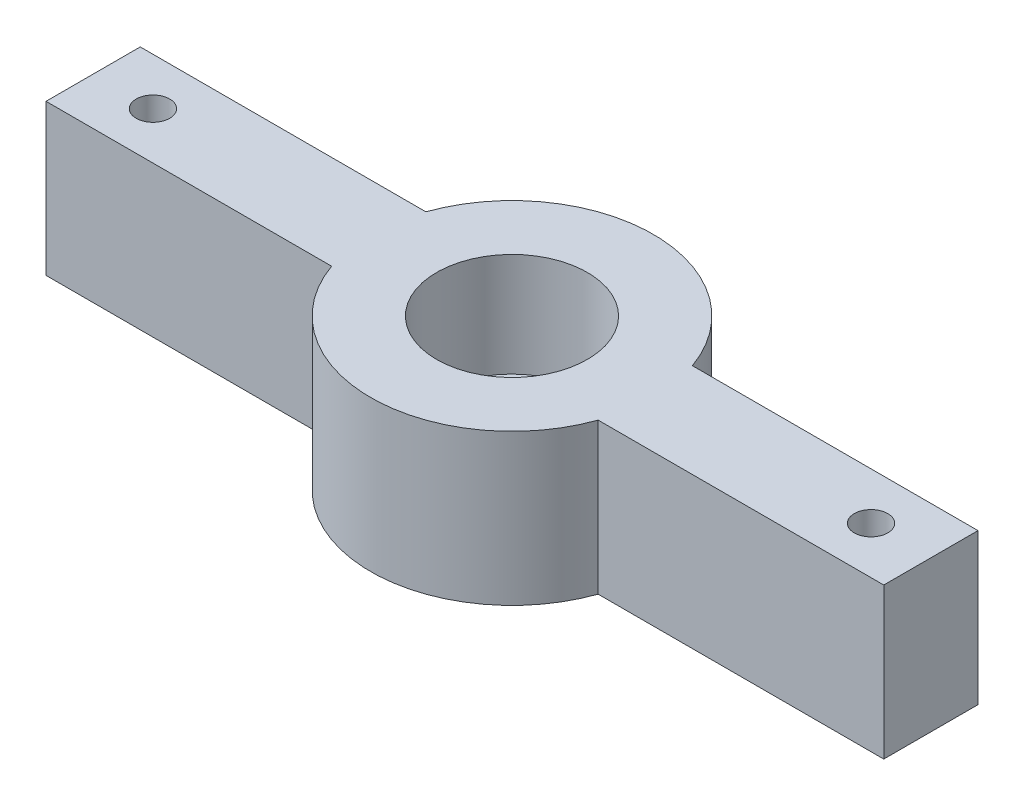
ISO-10303-21;
HEADER;
FILE_DESCRIPTION(('STEP AP214'),'2;1');
FILE_NAME('part.step','',(''),(''),'','','');
FILE_SCHEMA(('AUTOMOTIVE_DESIGN { 1 0 10303 214 1 1 1 1 }'));
ENDSEC;
DATA;
#1=APPLICATION_CONTEXT('core data for automotive mechanical design processes');
#2=APPLICATION_PROTOCOL_DEFINITION('international standard','automotive_design',2000,#1);
#3=PRODUCT_CONTEXT('',#1,'mechanical');
#4=PRODUCT('Part','Part','',(#3));
#5=PRODUCT_RELATED_PRODUCT_CATEGORY('part','',(#4));
#6=PRODUCT_DEFINITION_FORMATION('','',#4);
#7=PRODUCT_DEFINITION_CONTEXT('part definition',#1,'design');
#8=PRODUCT_DEFINITION('design','',#6,#7);
#9=PRODUCT_DEFINITION_SHAPE('','',#8);
#10=(LENGTH_UNIT() NAMED_UNIT(*) SI_UNIT(.MILLI.,.METRE.));
#11=(NAMED_UNIT(*) PLANE_ANGLE_UNIT() SI_UNIT($,.RADIAN.));
#12=(NAMED_UNIT(*) SI_UNIT($,.STERADIAN.) SOLID_ANGLE_UNIT());
#13=UNCERTAINTY_MEASURE_WITH_UNIT(LENGTH_MEASURE(1.E-05),#10,'distance_accuracy_value','');
#14=(GEOMETRIC_REPRESENTATION_CONTEXT(3) GLOBAL_UNCERTAINTY_ASSIGNED_CONTEXT((#13)) GLOBAL_UNIT_ASSIGNED_CONTEXT((#10,
#11,#12)) REPRESENTATION_CONTEXT('',''));
#15=CARTESIAN_POINT('',(0.,0.,0.));
#16=DIRECTION('',(0.,0.,1.));
#17=DIRECTION('',(1.,0.,0.));
#18=AXIS2_PLACEMENT_3D('',#15,#16,#17);
#19=CARTESIAN_POINT('',(0.,8.,0.));
#20=DIRECTION('',(0.,-1.,0.));
#21=DIRECTION('',(0.,0.,-1.));
#22=AXIS2_PLACEMENT_3D('',#19,#20,#21);
#23=CYLINDRICAL_SURFACE('',#22,1.875);
#24=CARTESIAN_POINT('',(0.,0.,0.));
#25=DIRECTION('',(0.,1.,0.));
#26=DIRECTION('',(0.,0.,1.));
#27=AXIS2_PLACEMENT_3D('',#24,#25,#26);
#28=CIRCLE('',#27,1.875);
#29=CARTESIAN_POINT('',(0.,0.,1.875));
#30=VERTEX_POINT('',#29);
#31=EDGE_CURVE('E136',#30,#30,#28,.T.);
#32=ORIENTED_EDGE('',*,*,#31,.F.);
#33=EDGE_LOOP('',(#32));
#34=FACE_BOUND('',#33,.T.);
#35=CARTESIAN_POINT('',(0.,2.5,0.));
#36=DIRECTION('',(0.,1.,0.));
#37=DIRECTION('',(0.,0.,1.));
#38=AXIS2_PLACEMENT_3D('',#35,#36,#37);
#39=CIRCLE('',#38,1.875);
#40=CARTESIAN_POINT('',(0.,2.5,1.875));
#41=VERTEX_POINT('',#40);
#42=EDGE_CURVE('E37',#41,#41,#39,.T.);
#43=ORIENTED_EDGE('',*,*,#42,.T.);
#44=EDGE_LOOP('',(#43));
#45=FACE_BOUND('',#44,.T.);
#46=ADVANCED_FACE('F33',(#34,#45),#23,.F.);
#47=CARTESIAN_POINT('',(0.,8.,0.));
#48=DIRECTION('',(0.,1.,0.));
#49=DIRECTION('',(0.,0.,1.));
#50=AXIS2_PLACEMENT_3D('',#47,#48,#49);
#51=PLANE('',#50);
#52=CARTESIAN_POINT('',(0.,8.,0.));
#53=DIRECTION('',(0.,1.,0.));
#54=DIRECTION('',(0.,0.,1.));
#55=AXIS2_PLACEMENT_3D('',#52,#53,#54);
#56=CIRCLE('',#55,4.);
#57=CARTESIAN_POINT('',(0.,8.,4.));
#58=VERTEX_POINT('',#57);
#59=EDGE_CURVE('E196',#58,#58,#56,.T.);
#60=ORIENTED_EDGE('',*,*,#59,.F.);
#61=EDGE_LOOP('',(#60));
#62=FACE_BOUND('',#61,.T.);
#63=CARTESIAN_POINT('',(-19.05,8.,0.));
#64=DIRECTION('',(0.,1.,0.));
#65=DIRECTION('',(0.,0.,1.));
#66=AXIS2_PLACEMENT_3D('',#63,#64,#65);
#67=CIRCLE('',#66,0.889);
#68=CARTESIAN_POINT('',(-19.05,8.,0.889));
#69=VERTEX_POINT('',#68);
#70=EDGE_CURVE('E184',#69,#69,#67,.T.);
#71=ORIENTED_EDGE('',*,*,#70,.F.);
#72=EDGE_LOOP('',(#71));
#73=FACE_BOUND('',#72,.T.);
#74=DIRECTION('',(-1.,0.,0.));
#75=VECTOR('',#74,1.);
#76=CARTESIAN_POINT('',(-7.07106781186548,8.,-2.5));
#77=LINE('',#76,#75);
#78=CARTESIAN_POINT('',(-7.07106781186548,8.,-2.5));
#79=VERTEX_POINT('',#78);
#80=CARTESIAN_POINT('',(-22.225,8.,-2.5));
#81=VERTEX_POINT('',#80);
#82=EDGE_CURVE('E147',#79,#81,#77,.T.);
#83=ORIENTED_EDGE('',*,*,#82,.T.);
#84=DIRECTION('',(0.,0.,1.));
#85=VECTOR('',#84,1.);
#86=CARTESIAN_POINT('',(-22.225,8.,-2.5));
#87=LINE('',#86,#85);
#88=CARTESIAN_POINT('',(-22.225,8.,2.5));
#89=VERTEX_POINT('',#88);
#90=EDGE_CURVE('E94',#81,#89,#87,.T.);
#91=ORIENTED_EDGE('',*,*,#90,.T.);
#92=DIRECTION('',(1.,0.,0.));
#93=VECTOR('',#92,1.);
#94=CARTESIAN_POINT('',(-22.225,8.,2.5));
#95=LINE('',#94,#93);
#96=CARTESIAN_POINT('',(-7.07106781186548,8.,2.5));
#97=VERTEX_POINT('',#96);
#98=EDGE_CURVE('E163',#89,#97,#95,.T.);
#99=ORIENTED_EDGE('',*,*,#98,.T.);
#100=CARTESIAN_POINT('',(0.,8.,0.));
#101=DIRECTION('',(0.,1.,0.));
#102=DIRECTION('',(0.,0.,1.));
#103=AXIS2_PLACEMENT_3D('',#100,#101,#102);
#104=CIRCLE('',#103,7.5);
#105=CARTESIAN_POINT('',(7.07106781186548,8.,2.5));
#106=VERTEX_POINT('',#105);
#107=EDGE_CURVE('E176',#97,#106,#104,.T.);
#108=ORIENTED_EDGE('',*,*,#107,.T.);
#109=DIRECTION('',(1.,0.,0.));
#110=VECTOR('',#109,1.);
#111=CARTESIAN_POINT('',(7.07106781186548,8.,2.5));
#112=LINE('',#111,#110);
#113=CARTESIAN_POINT('',(22.225,8.,2.5));
#114=VERTEX_POINT('',#113);
#115=EDGE_CURVE('E114',#106,#114,#112,.T.);
#116=ORIENTED_EDGE('',*,*,#115,.T.);
#117=DIRECTION('',(0.,0.,-1.));
#118=VECTOR('',#117,1.);
#119=CARTESIAN_POINT('',(22.225,8.,2.5));
#120=LINE('',#119,#118);
#121=CARTESIAN_POINT('',(22.225,8.,-2.5));
#122=VERTEX_POINT('',#121);
#123=EDGE_CURVE('E107',#114,#122,#120,.T.);
#124=ORIENTED_EDGE('',*,*,#123,.T.);
#125=DIRECTION('',(-1.,0.,0.));
#126=VECTOR('',#125,1.);
#127=CARTESIAN_POINT('',(22.225,8.,-2.5));
#128=LINE('',#127,#126);
#129=CARTESIAN_POINT('',(7.07106781186548,8.,-2.5));
#130=VERTEX_POINT('',#129);
#131=EDGE_CURVE('E112',#122,#130,#128,.T.);
#132=ORIENTED_EDGE('',*,*,#131,.T.);
#133=CARTESIAN_POINT('',(0.,8.,0.));
#134=DIRECTION('',(0.,1.,0.));
#135=DIRECTION('',(0.,0.,1.));
#136=AXIS2_PLACEMENT_3D('',#133,#134,#135);
#137=CIRCLE('',#136,7.5);
#138=EDGE_CURVE('E51',#130,#79,#137,.T.);
#139=ORIENTED_EDGE('',*,*,#138,.T.);
#140=EDGE_LOOP('',(#83,#91,#99,#108,#116,#124,#132,#139));
#141=FACE_BOUND('',#140,.T.);
#142=CARTESIAN_POINT('',(19.05,8.,0.));
#143=DIRECTION('',(0.,1.,0.));
#144=DIRECTION('',(0.,0.,-1.));
#145=AXIS2_PLACEMENT_3D('',#142,#143,#144);
#146=CIRCLE('',#145,0.889);
#147=CARTESIAN_POINT('',(19.05,8.,-0.889));
#148=VERTEX_POINT('',#147);
#149=EDGE_CURVE('E188',#148,#148,#146,.T.);
#150=ORIENTED_EDGE('',*,*,#149,.F.);
#151=EDGE_LOOP('',(#150));
#152=FACE_BOUND('',#151,.T.);
#153=ADVANCED_FACE('F109',(#62,#73,#141,#152),#51,.T.);
#154=CARTESIAN_POINT('',(0.,0.,0.));
#155=DIRECTION('',(0.,1.,0.));
#156=DIRECTION('',(0.,0.,1.));
#157=AXIS2_PLACEMENT_3D('',#154,#155,#156);
#158=PLANE('',#157);
#159=CARTESIAN_POINT('',(-19.05,0.,0.));
#160=DIRECTION('',(0.,1.,0.));
#161=DIRECTION('',(0.,0.,1.));
#162=AXIS2_PLACEMENT_3D('',#159,#160,#161);
#163=CIRCLE('',#162,0.889);
#164=CARTESIAN_POINT('',(-19.05,0.,0.889));
#165=VERTEX_POINT('',#164);
#166=EDGE_CURVE('E185',#165,#165,#163,.T.);
#167=ORIENTED_EDGE('',*,*,#166,.T.);
#168=EDGE_LOOP('',(#167));
#169=FACE_BOUND('',#168,.T.);
#170=DIRECTION('',(-1.,0.,0.));
#171=VECTOR('',#170,1.);
#172=CARTESIAN_POINT('',(-7.07106781186548,0.,-2.5));
#173=LINE('',#172,#171);
#174=CARTESIAN_POINT('',(-7.07106781186548,0.,-2.5));
#175=VERTEX_POINT('',#174);
#176=CARTESIAN_POINT('',(-22.225,0.,-2.5));
#177=VERTEX_POINT('',#176);
#178=EDGE_CURVE('E132',#175,#177,#173,.T.);
#179=ORIENTED_EDGE('',*,*,#178,.F.);
#180=CARTESIAN_POINT('',(0.,0.,0.));
#181=DIRECTION('',(0.,1.,0.));
#182=DIRECTION('',(0.,0.,1.));
#183=AXIS2_PLACEMENT_3D('',#180,#181,#182);
#184=CIRCLE('',#183,7.5);
#185=CARTESIAN_POINT('',(7.07106781186548,0.,-2.5));
#186=VERTEX_POINT('',#185);
#187=EDGE_CURVE('E86',#186,#175,#184,.T.);
#188=ORIENTED_EDGE('',*,*,#187,.F.);
#189=DIRECTION('',(-1.,0.,0.));
#190=VECTOR('',#189,1.);
#191=CARTESIAN_POINT('',(22.225,0.,-2.5));
#192=LINE('',#191,#190);
#193=CARTESIAN_POINT('',(22.225,0.,-2.5));
#194=VERTEX_POINT('',#193);
#195=EDGE_CURVE('E80',#194,#186,#192,.T.);
#196=ORIENTED_EDGE('',*,*,#195,.F.);
#197=DIRECTION('',(0.,0.,-1.));
#198=VECTOR('',#197,1.);
#199=CARTESIAN_POINT('',(22.225,0.,2.5));
#200=LINE('',#199,#198);
#201=CARTESIAN_POINT('',(22.225,0.,2.5));
#202=VERTEX_POINT('',#201);
#203=EDGE_CURVE('E122',#202,#194,#200,.T.);
#204=ORIENTED_EDGE('',*,*,#203,.F.);
#205=DIRECTION('',(1.,0.,0.));
#206=VECTOR('',#205,1.);
#207=CARTESIAN_POINT('',(7.07106781186548,0.,2.5));
#208=LINE('',#207,#206);
#209=CARTESIAN_POINT('',(7.07106781186548,0.,2.5));
#210=VERTEX_POINT('',#209);
#211=EDGE_CURVE('E142',#210,#202,#208,.T.);
#212=ORIENTED_EDGE('',*,*,#211,.F.);
#213=CARTESIAN_POINT('',(0.,0.,0.));
#214=DIRECTION('',(0.,1.,0.));
#215=DIRECTION('',(0.,0.,1.));
#216=AXIS2_PLACEMENT_3D('',#213,#214,#215);
#217=CIRCLE('',#216,7.5);
#218=CARTESIAN_POINT('',(-7.07106781186548,0.,2.5));
#219=VERTEX_POINT('',#218);
#220=EDGE_CURVE('E140',#219,#210,#217,.T.);
#221=ORIENTED_EDGE('',*,*,#220,.F.);
#222=DIRECTION('',(1.,0.,0.));
#223=VECTOR('',#222,1.);
#224=CARTESIAN_POINT('',(-22.225,0.,2.5));
#225=LINE('',#224,#223);
#226=CARTESIAN_POINT('',(-22.225,0.,2.5));
#227=VERTEX_POINT('',#226);
#228=EDGE_CURVE('E138',#227,#219,#225,.T.);
#229=ORIENTED_EDGE('',*,*,#228,.F.);
#230=DIRECTION('',(0.,0.,1.));
#231=VECTOR('',#230,1.);
#232=CARTESIAN_POINT('',(-22.225,0.,-2.5));
#233=LINE('',#232,#231);
#234=EDGE_CURVE('E135',#177,#227,#233,.T.);
#235=ORIENTED_EDGE('',*,*,#234,.F.);
#236=EDGE_LOOP('',(#179,#188,#196,#204,#212,#221,#229,#235));
#237=FACE_BOUND('',#236,.T.);
#238=ORIENTED_EDGE('',*,*,#31,.T.);
#239=EDGE_LOOP('',(#238));
#240=FACE_BOUND('',#239,.T.);
#241=CARTESIAN_POINT('',(19.05,0.,0.));
#242=DIRECTION('',(0.,1.,0.));
#243=DIRECTION('',(0.,0.,-1.));
#244=AXIS2_PLACEMENT_3D('',#241,#242,#243);
#245=CIRCLE('',#244,0.889);
#246=CARTESIAN_POINT('',(19.05,0.,-0.889));
#247=VERTEX_POINT('',#246);
#248=EDGE_CURVE('E191',#247,#247,#245,.T.);
#249=ORIENTED_EDGE('',*,*,#248,.T.);
#250=EDGE_LOOP('',(#249));
#251=FACE_BOUND('',#250,.T.);
#252=ADVANCED_FACE('F167',(#169,#237,#240,#251),#158,.F.);
#253=CARTESIAN_POINT('',(-7.07106781186548,8.,-2.5));
#254=DIRECTION('',(0.,0.,1.));
#255=DIRECTION('',(1.,0.,0.));
#256=AXIS2_PLACEMENT_3D('',#253,#254,#255);
#257=PLANE('',#256);
#258=ORIENTED_EDGE('',*,*,#178,.T.);
#259=DIRECTION('',(0.,-1.,0.));
#260=VECTOR('',#259,1.);
#261=CARTESIAN_POINT('',(-22.225,8.,-2.5));
#262=LINE('',#261,#260);
#263=EDGE_CURVE('E11',#81,#177,#262,.T.);
#264=ORIENTED_EDGE('',*,*,#263,.F.);
#265=ORIENTED_EDGE('',*,*,#82,.F.);
#266=DIRECTION('',(0.,-1.,0.));
#267=VECTOR('',#266,1.);
#268=CARTESIAN_POINT('',(-7.07106781186548,8.,-2.5));
#269=LINE('',#268,#267);
#270=EDGE_CURVE('E128',#79,#175,#269,.T.);
#271=ORIENTED_EDGE('',*,*,#270,.T.);
#272=EDGE_LOOP('',(#258,#264,#265,#271));
#273=FACE_BOUND('',#272,.T.);
#274=ADVANCED_FACE('F35',(#273),#257,.F.);
#275=CARTESIAN_POINT('',(-22.225,8.,-2.5));
#276=DIRECTION('',(1.,0.,0.));
#277=DIRECTION('',(0.,0.,-1.));
#278=AXIS2_PLACEMENT_3D('',#275,#276,#277);
#279=PLANE('',#278);
#280=ORIENTED_EDGE('',*,*,#234,.T.);
#281=DIRECTION('',(0.,-1.,0.));
#282=VECTOR('',#281,1.);
#283=CARTESIAN_POINT('',(-22.225,8.,2.5));
#284=LINE('',#283,#282);
#285=EDGE_CURVE('E43',#89,#227,#284,.T.);
#286=ORIENTED_EDGE('',*,*,#285,.F.);
#287=ORIENTED_EDGE('',*,*,#90,.F.);
#288=ORIENTED_EDGE('',*,*,#263,.T.);
#289=EDGE_LOOP('',(#280,#286,#287,#288));
#290=FACE_BOUND('',#289,.T.);
#291=ADVANCED_FACE('F245',(#290),#279,.F.);
#292=CARTESIAN_POINT('',(-22.225,8.,2.5));
#293=DIRECTION('',(0.,0.,-1.));
#294=DIRECTION('',(-1.,0.,0.));
#295=AXIS2_PLACEMENT_3D('',#292,#293,#294);
#296=PLANE('',#295);
#297=ORIENTED_EDGE('',*,*,#228,.T.);
#298=DIRECTION('',(0.,-1.,0.));
#299=VECTOR('',#298,1.);
#300=CARTESIAN_POINT('',(-7.07106781186548,8.,2.5));
#301=LINE('',#300,#299);
#302=EDGE_CURVE('E154',#97,#219,#301,.T.);
#303=ORIENTED_EDGE('',*,*,#302,.F.);
#304=ORIENTED_EDGE('',*,*,#98,.F.);
#305=ORIENTED_EDGE('',*,*,#285,.T.);
#306=EDGE_LOOP('',(#297,#303,#304,#305));
#307=FACE_BOUND('',#306,.T.);
#308=ADVANCED_FACE('F161',(#307),#296,.F.);
#309=CARTESIAN_POINT('',(0.,8.,0.));
#310=DIRECTION('',(0.,-1.,0.));
#311=DIRECTION('',(0.,0.,-1.));
#312=AXIS2_PLACEMENT_3D('',#309,#310,#311);
#313=CYLINDRICAL_SURFACE('',#312,7.5);
#314=ORIENTED_EDGE('',*,*,#220,.T.);
#315=DIRECTION('',(0.,-1.,0.));
#316=VECTOR('',#315,1.);
#317=CARTESIAN_POINT('',(7.07106781186548,8.,2.5));
#318=LINE('',#317,#316);
#319=EDGE_CURVE('E151',#106,#210,#318,.T.);
#320=ORIENTED_EDGE('',*,*,#319,.F.);
#321=ORIENTED_EDGE('',*,*,#107,.F.);
#322=ORIENTED_EDGE('',*,*,#302,.T.);
#323=EDGE_LOOP('',(#314,#320,#321,#322));
#324=FACE_BOUND('',#323,.T.);
#325=ADVANCED_FACE('F172',(#324),#313,.T.);
#326=CARTESIAN_POINT('',(7.07106781186548,8.,2.5));
#327=DIRECTION('',(0.,0.,-1.));
#328=DIRECTION('',(-1.,0.,0.));
#329=AXIS2_PLACEMENT_3D('',#326,#327,#328);
#330=PLANE('',#329);
#331=ORIENTED_EDGE('',*,*,#211,.T.);
#332=DIRECTION('',(0.,-1.,0.));
#333=VECTOR('',#332,1.);
#334=CARTESIAN_POINT('',(22.225,8.,2.5));
#335=LINE('',#334,#333);
#336=EDGE_CURVE('E123',#114,#202,#335,.T.);
#337=ORIENTED_EDGE('',*,*,#336,.F.);
#338=ORIENTED_EDGE('',*,*,#115,.F.);
#339=ORIENTED_EDGE('',*,*,#319,.T.);
#340=EDGE_LOOP('',(#331,#337,#338,#339));
#341=FACE_BOUND('',#340,.T.);
#342=ADVANCED_FACE('F175',(#341),#330,.F.);
#343=CARTESIAN_POINT('',(22.225,8.,2.5));
#344=DIRECTION('',(-1.,0.,0.));
#345=DIRECTION('',(0.,0.,1.));
#346=AXIS2_PLACEMENT_3D('',#343,#344,#345);
#347=PLANE('',#346);
#348=ORIENTED_EDGE('',*,*,#203,.T.);
#349=DIRECTION('',(0.,-1.,0.));
#350=VECTOR('',#349,1.);
#351=CARTESIAN_POINT('',(22.225,8.,-2.5));
#352=LINE('',#351,#350);
#353=EDGE_CURVE('E119',#122,#194,#352,.T.);
#354=ORIENTED_EDGE('',*,*,#353,.F.);
#355=ORIENTED_EDGE('',*,*,#123,.F.);
#356=ORIENTED_EDGE('',*,*,#336,.T.);
#357=EDGE_LOOP('',(#348,#354,#355,#356));
#358=FACE_BOUND('',#357,.T.);
#359=ADVANCED_FACE('F120',(#358),#347,.F.);
#360=CARTESIAN_POINT('',(22.225,8.,-2.5));
#361=DIRECTION('',(0.,0.,1.));
#362=DIRECTION('',(1.,0.,0.));
#363=AXIS2_PLACEMENT_3D('',#360,#361,#362);
#364=PLANE('',#363);
#365=ORIENTED_EDGE('',*,*,#195,.T.);
#366=DIRECTION('',(0.,-1.,0.));
#367=VECTOR('',#366,1.);
#368=CARTESIAN_POINT('',(7.07106781186548,8.,-2.5));
#369=LINE('',#368,#367);
#370=EDGE_CURVE('E124',#130,#186,#369,.T.);
#371=ORIENTED_EDGE('',*,*,#370,.F.);
#372=ORIENTED_EDGE('',*,*,#131,.F.);
#373=ORIENTED_EDGE('',*,*,#353,.T.);
#374=EDGE_LOOP('',(#365,#371,#372,#373));
#375=FACE_BOUND('',#374,.T.);
#376=ADVANCED_FACE('F126',(#375),#364,.F.);
#377=CARTESIAN_POINT('',(0.,8.,0.));
#378=DIRECTION('',(0.,-1.,0.));
#379=DIRECTION('',(0.,0.,-1.));
#380=AXIS2_PLACEMENT_3D('',#377,#378,#379);
#381=CYLINDRICAL_SURFACE('',#380,7.5);
#382=ORIENTED_EDGE('',*,*,#187,.T.);
#383=ORIENTED_EDGE('',*,*,#270,.F.);
#384=ORIENTED_EDGE('',*,*,#138,.F.);
#385=ORIENTED_EDGE('',*,*,#370,.T.);
#386=EDGE_LOOP('',(#382,#383,#384,#385));
#387=FACE_BOUND('',#386,.T.);
#388=ADVANCED_FACE('F233',(#387),#381,.T.);
#389=CARTESIAN_POINT('',(-19.05,8.,0.));
#390=DIRECTION('',(0.,-1.,0.));
#391=DIRECTION('',(0.,0.,-1.));
#392=AXIS2_PLACEMENT_3D('',#389,#390,#391);
#393=CYLINDRICAL_SURFACE('',#392,0.889);
#394=ORIENTED_EDGE('',*,*,#70,.T.);
#395=EDGE_LOOP('',(#394));
#396=FACE_BOUND('',#395,.T.);
#397=ORIENTED_EDGE('',*,*,#166,.F.);
#398=EDGE_LOOP('',(#397));
#399=FACE_BOUND('',#398,.T.);
#400=ADVANCED_FACE('F227',(#396,#399),#393,.F.);
#401=CARTESIAN_POINT('',(19.05,8.,0.));
#402=DIRECTION('',(0.,-1.,0.));
#403=DIRECTION('',(0.,0.,-1.));
#404=AXIS2_PLACEMENT_3D('',#401,#402,#403);
#405=CYLINDRICAL_SURFACE('',#404,0.889);
#406=ORIENTED_EDGE('',*,*,#149,.T.);
#407=EDGE_LOOP('',(#406));
#408=FACE_BOUND('',#407,.T.);
#409=ORIENTED_EDGE('',*,*,#248,.F.);
#410=EDGE_LOOP('',(#409));
#411=FACE_BOUND('',#410,.T.);
#412=ADVANCED_FACE('F214',(#408,#411),#405,.F.);
#413=CARTESIAN_POINT('',(0.,2.5,0.));
#414=DIRECTION('',(0.,1.,0.));
#415=DIRECTION('',(0.,0.,1.));
#416=AXIS2_PLACEMENT_3D('',#413,#414,#415);
#417=CYLINDRICAL_SURFACE('',#416,4.);
#418=CARTESIAN_POINT('',(0.,2.5,0.));
#419=DIRECTION('',(0.,1.,0.));
#420=DIRECTION('',(0.,0.,1.));
#421=AXIS2_PLACEMENT_3D('',#418,#419,#420);
#422=CIRCLE('',#421,4.);
#423=CARTESIAN_POINT('',(0.,2.5,4.));
#424=VERTEX_POINT('',#423);
#425=EDGE_CURVE('E199',#424,#424,#422,.T.);
#426=ORIENTED_EDGE('',*,*,#425,.F.);
#427=EDGE_LOOP('',(#426));
#428=FACE_BOUND('',#427,.T.);
#429=ORIENTED_EDGE('',*,*,#59,.T.);
#430=EDGE_LOOP('',(#429));
#431=FACE_BOUND('',#430,.T.);
#432=ADVANCED_FACE('F209',(#428,#431),#417,.F.);
#433=CARTESIAN_POINT('',(0.,2.5,0.));
#434=DIRECTION('',(0.,1.,0.));
#435=DIRECTION('',(0.,0.,1.));
#436=AXIS2_PLACEMENT_3D('',#433,#434,#435);
#437=PLANE('',#436);
#438=ORIENTED_EDGE('',*,*,#42,.F.);
#439=EDGE_LOOP('',(#438));
#440=FACE_BOUND('',#439,.T.);
#441=ORIENTED_EDGE('',*,*,#425,.T.);
#442=EDGE_LOOP('',(#441));
#443=FACE_BOUND('',#442,.T.);
#444=ADVANCED_FACE('F207',(#440,#443),#437,.T.);
#445=CLOSED_SHELL('',(#46,#153,#252,#274,#291,#308,#325,#342,#359,#376,#388,#400,#412,#432,#444));
#446=MANIFOLD_SOLID_BREP('B2',#445);
#447=ADVANCED_BREP_SHAPE_REPRESENTATION('',(#18,#446),#14);
#448=SHAPE_DEFINITION_REPRESENTATION(#9,#447);
ENDSEC;
END-ISO-10303-21;
